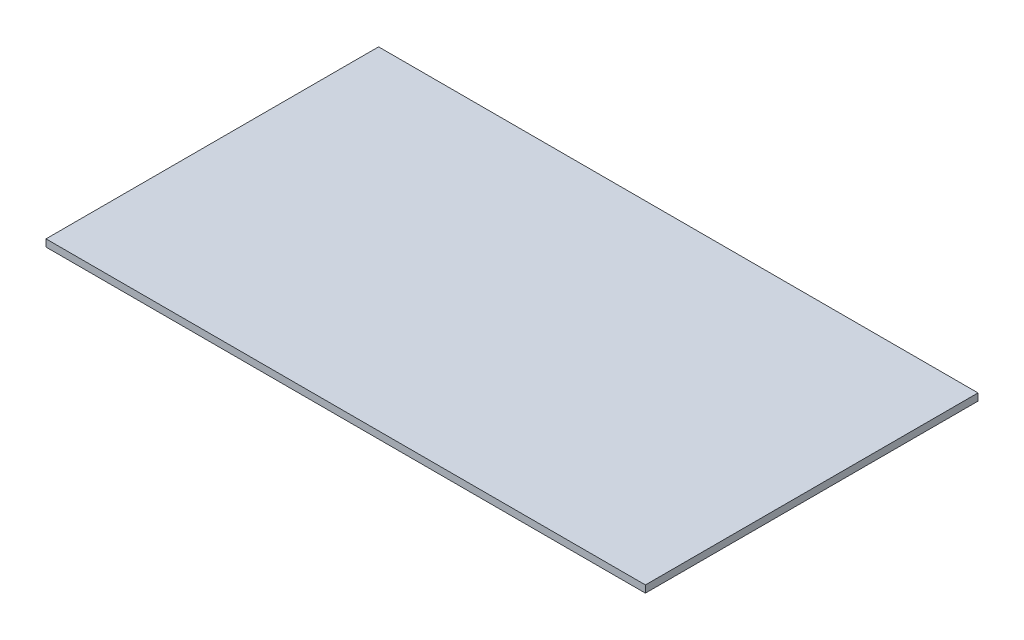
ISO-10303-21;
HEADER;
FILE_DESCRIPTION(('STEP AP214'),'2;1');
FILE_NAME('part.step','',(''),(''),'','','');
FILE_SCHEMA(('AUTOMOTIVE_DESIGN { 1 0 10303 214 1 1 1 1 }'));
ENDSEC;
DATA;
#1=APPLICATION_CONTEXT('core data for automotive mechanical design processes');
#2=APPLICATION_PROTOCOL_DEFINITION('international standard','automotive_design',2000,#1);
#3=PRODUCT_CONTEXT('',#1,'mechanical');
#4=PRODUCT('Part','Part','',(#3));
#5=PRODUCT_RELATED_PRODUCT_CATEGORY('part','',(#4));
#6=PRODUCT_DEFINITION_FORMATION('','',#4);
#7=PRODUCT_DEFINITION_CONTEXT('part definition',#1,'design');
#8=PRODUCT_DEFINITION('design','',#6,#7);
#9=PRODUCT_DEFINITION_SHAPE('','',#8);
#10=(LENGTH_UNIT() NAMED_UNIT(*) SI_UNIT(.MILLI.,.METRE.));
#11=(NAMED_UNIT(*) PLANE_ANGLE_UNIT() SI_UNIT($,.RADIAN.));
#12=(NAMED_UNIT(*) SI_UNIT($,.STERADIAN.) SOLID_ANGLE_UNIT());
#13=UNCERTAINTY_MEASURE_WITH_UNIT(LENGTH_MEASURE(1.E-05),#10,'distance_accuracy_value','');
#14=(GEOMETRIC_REPRESENTATION_CONTEXT(3) GLOBAL_UNCERTAINTY_ASSIGNED_CONTEXT((#13)) GLOBAL_UNIT_ASSIGNED_CONTEXT((#10,
#11,#12)) REPRESENTATION_CONTEXT('',''));
#15=CARTESIAN_POINT('',(0.,0.,0.));
#16=DIRECTION('',(0.,0.,1.));
#17=DIRECTION('',(1.,0.,0.));
#18=AXIS2_PLACEMENT_3D('',#15,#16,#17);
#19=CARTESIAN_POINT('',(6.29,0.075,-3.49));
#20=DIRECTION('',(-1.,0.,0.));
#21=DIRECTION('',(0.,0.,1.));
#22=AXIS2_PLACEMENT_3D('',#19,#20,#21);
#23=PLANE('',#22);
#24=DIRECTION('',(0.,0.,-1.));
#25=VECTOR('',#24,1.);
#26=CARTESIAN_POINT('',(6.29,-0.075,-3.49));
#27=LINE('',#26,#25);
#28=CARTESIAN_POINT('',(6.29,-0.075,3.49));
#29=VERTEX_POINT('',#28);
#30=CARTESIAN_POINT('',(6.29,-0.075,-3.49));
#31=VERTEX_POINT('',#30);
#32=EDGE_CURVE('E99',#29,#31,#27,.T.);
#33=ORIENTED_EDGE('',*,*,#32,.T.);
#34=DIRECTION('',(0.,-1.,0.));
#35=VECTOR('',#34,1.);
#36=CARTESIAN_POINT('',(6.29,0.075,-3.49));
#37=LINE('',#36,#35);
#38=CARTESIAN_POINT('',(6.29,0.075,-3.49));
#39=VERTEX_POINT('',#38);
#40=EDGE_CURVE('E11',#39,#31,#37,.T.);
#41=ORIENTED_EDGE('',*,*,#40,.F.);
#42=DIRECTION('',(0.,0.,-1.));
#43=VECTOR('',#42,1.);
#44=CARTESIAN_POINT('',(6.29,0.075,-3.49));
#45=LINE('',#44,#43);
#46=CARTESIAN_POINT('',(6.29,0.075,3.49));
#47=VERTEX_POINT('',#46);
#48=EDGE_CURVE('E87',#47,#39,#45,.T.);
#49=ORIENTED_EDGE('',*,*,#48,.F.);
#50=DIRECTION('',(0.,-1.,0.));
#51=VECTOR('',#50,1.);
#52=CARTESIAN_POINT('',(6.29,0.075,3.49));
#53=LINE('',#52,#51);
#54=EDGE_CURVE('E95',#47,#29,#53,.T.);
#55=ORIENTED_EDGE('',*,*,#54,.T.);
#56=EDGE_LOOP('',(#33,#41,#49,#55));
#57=FACE_BOUND('',#56,.T.);
#58=ADVANCED_FACE('F36',(#57),#23,.F.);
#59=CARTESIAN_POINT('',(-6.29,0.075,-3.49));
#60=DIRECTION('',(0.,0.,1.));
#61=DIRECTION('',(1.,0.,0.));
#62=AXIS2_PLACEMENT_3D('',#59,#60,#61);
#63=PLANE('',#62);
#64=DIRECTION('',(-1.,0.,0.));
#65=VECTOR('',#64,1.);
#66=CARTESIAN_POINT('',(-6.29,-0.075,-3.49));
#67=LINE('',#66,#65);
#68=CARTESIAN_POINT('',(-6.29,-0.075,-3.49));
#69=VERTEX_POINT('',#68);
#70=EDGE_CURVE('E91',#31,#69,#67,.T.);
#71=ORIENTED_EDGE('',*,*,#70,.T.);
#72=DIRECTION('',(0.,-1.,0.));
#73=VECTOR('',#72,1.);
#74=CARTESIAN_POINT('',(-6.29,0.075,-3.49));
#75=LINE('',#74,#73);
#76=CARTESIAN_POINT('',(-6.29,0.075,-3.49));
#77=VERTEX_POINT('',#76);
#78=EDGE_CURVE('E44',#77,#69,#75,.T.);
#79=ORIENTED_EDGE('',*,*,#78,.F.);
#80=DIRECTION('',(-1.,0.,0.));
#81=VECTOR('',#80,1.);
#82=CARTESIAN_POINT('',(-6.29,0.075,-3.49));
#83=LINE('',#82,#81);
#84=EDGE_CURVE('E82',#39,#77,#83,.T.);
#85=ORIENTED_EDGE('',*,*,#84,.F.);
#86=ORIENTED_EDGE('',*,*,#40,.T.);
#87=EDGE_LOOP('',(#71,#79,#85,#86));
#88=FACE_BOUND('',#87,.T.);
#89=ADVANCED_FACE('F90',(#88),#63,.F.);
#90=CARTESIAN_POINT('',(-6.29,0.075,-3.49));
#91=DIRECTION('',(1.,0.,0.));
#92=DIRECTION('',(0.,0.,-1.));
#93=AXIS2_PLACEMENT_3D('',#90,#91,#92);
#94=PLANE('',#93);
#95=DIRECTION('',(0.,0.,1.));
#96=VECTOR('',#95,1.);
#97=CARTESIAN_POINT('',(-6.29,-0.075,-3.49));
#98=LINE('',#97,#96);
#99=CARTESIAN_POINT('',(-6.29,-0.075,3.49));
#100=VERTEX_POINT('',#99);
#101=EDGE_CURVE('E69',#69,#100,#98,.T.);
#102=ORIENTED_EDGE('',*,*,#101,.T.);
#103=DIRECTION('',(0.,-1.,0.));
#104=VECTOR('',#103,1.);
#105=CARTESIAN_POINT('',(-6.29,0.075,3.49));
#106=LINE('',#105,#104);
#107=CARTESIAN_POINT('',(-6.29,0.075,3.49));
#108=VERTEX_POINT('',#107);
#109=EDGE_CURVE('E92',#108,#100,#106,.T.);
#110=ORIENTED_EDGE('',*,*,#109,.F.);
#111=DIRECTION('',(0.,0.,1.));
#112=VECTOR('',#111,1.);
#113=CARTESIAN_POINT('',(-6.29,0.075,-3.49));
#114=LINE('',#113,#112);
#115=EDGE_CURVE('E85',#77,#108,#114,.T.);
#116=ORIENTED_EDGE('',*,*,#115,.F.);
#117=ORIENTED_EDGE('',*,*,#78,.T.);
#118=EDGE_LOOP('',(#102,#110,#116,#117));
#119=FACE_BOUND('',#118,.T.);
#120=ADVANCED_FACE('F93',(#119),#94,.F.);
#121=CARTESIAN_POINT('',(-6.29,0.075,3.49));
#122=DIRECTION('',(0.,0.,-1.));
#123=DIRECTION('',(-1.,0.,0.));
#124=AXIS2_PLACEMENT_3D('',#121,#122,#123);
#125=PLANE('',#124);
#126=DIRECTION('',(1.,0.,0.));
#127=VECTOR('',#126,1.);
#128=CARTESIAN_POINT('',(-6.29,-0.075,3.49));
#129=LINE('',#128,#127);
#130=EDGE_CURVE('E75',#100,#29,#129,.T.);
#131=ORIENTED_EDGE('',*,*,#130,.T.);
#132=ORIENTED_EDGE('',*,*,#54,.F.);
#133=DIRECTION('',(1.,0.,0.));
#134=VECTOR('',#133,1.);
#135=CARTESIAN_POINT('',(-6.29,0.075,3.49));
#136=LINE('',#135,#134);
#137=EDGE_CURVE('E52',#108,#47,#136,.T.);
#138=ORIENTED_EDGE('',*,*,#137,.F.);
#139=ORIENTED_EDGE('',*,*,#109,.T.);
#140=EDGE_LOOP('',(#131,#132,#138,#139));
#141=FACE_BOUND('',#140,.T.);
#142=ADVANCED_FACE('F106',(#141),#125,.F.);
#143=CARTESIAN_POINT('',(0.,0.075,0.));
#144=DIRECTION('',(0.,1.,0.));
#145=DIRECTION('',(0.,0.,1.));
#146=AXIS2_PLACEMENT_3D('',#143,#144,#145);
#147=PLANE('',#146);
#148=ORIENTED_EDGE('',*,*,#48,.T.);
#149=ORIENTED_EDGE('',*,*,#84,.T.);
#150=ORIENTED_EDGE('',*,*,#115,.T.);
#151=ORIENTED_EDGE('',*,*,#137,.T.);
#152=EDGE_LOOP('',(#148,#149,#150,#151));
#153=FACE_BOUND('',#152,.T.);
#154=ADVANCED_FACE('F83',(#153),#147,.T.);
#155=CARTESIAN_POINT('',(0.,-0.075,0.));
#156=DIRECTION('',(0.,1.,0.));
#157=DIRECTION('',(0.,0.,1.));
#158=AXIS2_PLACEMENT_3D('',#155,#156,#157);
#159=PLANE('',#158);
#160=ORIENTED_EDGE('',*,*,#32,.F.);
#161=ORIENTED_EDGE('',*,*,#130,.F.);
#162=ORIENTED_EDGE('',*,*,#101,.F.);
#163=ORIENTED_EDGE('',*,*,#70,.F.);
#164=EDGE_LOOP('',(#160,#161,#162,#163));
#165=FACE_BOUND('',#164,.T.);
#166=ADVANCED_FACE('F109',(#165),#159,.F.);
#167=CLOSED_SHELL('',(#58,#89,#120,#142,#154,#166));
#168=MANIFOLD_SOLID_BREP('B2',#167);
#169=ADVANCED_BREP_SHAPE_REPRESENTATION('',(#18,#168),#14);
#170=SHAPE_DEFINITION_REPRESENTATION(#9,#169);
ENDSEC;
END-ISO-10303-21;
